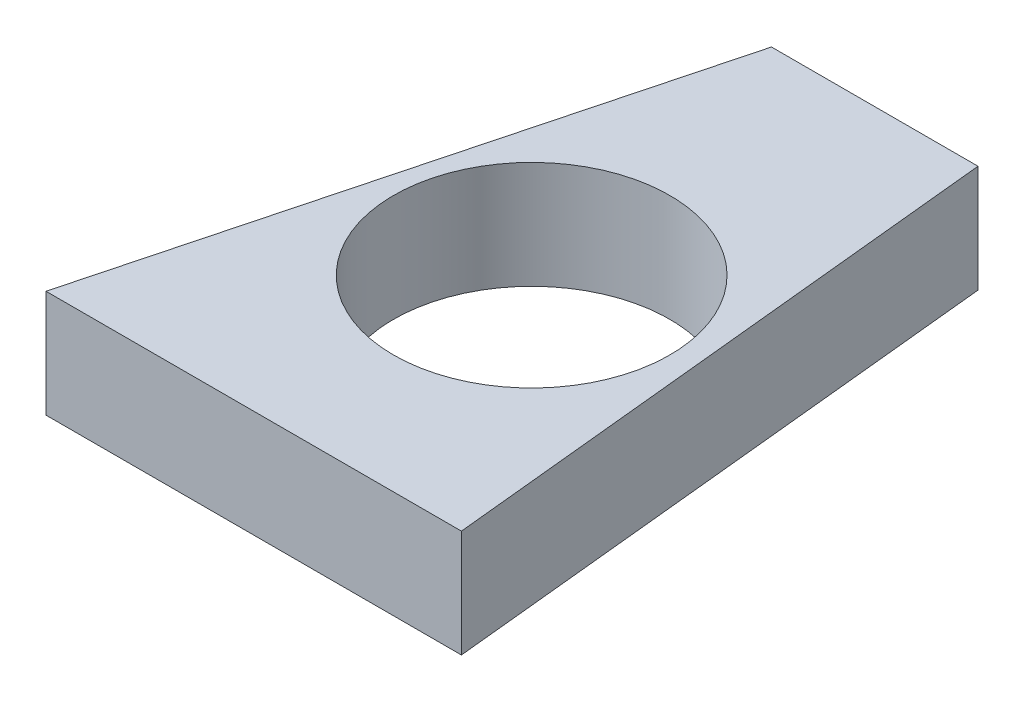
ISO-10303-21;
HEADER;
FILE_DESCRIPTION(('STEP AP214'),'2;1');
FILE_NAME('part.step','',(''),(''),'','','');
FILE_SCHEMA(('AUTOMOTIVE_DESIGN { 1 0 10303 214 1 1 1 1 }'));
ENDSEC;
DATA;
#1=APPLICATION_CONTEXT('core data for automotive mechanical design processes');
#2=APPLICATION_PROTOCOL_DEFINITION('international standard','automotive_design',2000,#1);
#3=PRODUCT_CONTEXT('',#1,'mechanical');
#4=PRODUCT('Part','Part','',(#3));
#5=PRODUCT_RELATED_PRODUCT_CATEGORY('part','',(#4));
#6=PRODUCT_DEFINITION_FORMATION('','',#4);
#7=PRODUCT_DEFINITION_CONTEXT('part definition',#1,'design');
#8=PRODUCT_DEFINITION('design','',#6,#7);
#9=PRODUCT_DEFINITION_SHAPE('','',#8);
#10=(LENGTH_UNIT() NAMED_UNIT(*) SI_UNIT(.MILLI.,.METRE.));
#11=(NAMED_UNIT(*) PLANE_ANGLE_UNIT() SI_UNIT($,.RADIAN.));
#12=(NAMED_UNIT(*) SI_UNIT($,.STERADIAN.) SOLID_ANGLE_UNIT());
#13=UNCERTAINTY_MEASURE_WITH_UNIT(LENGTH_MEASURE(1.E-05),#10,'distance_accuracy_value','');
#14=(GEOMETRIC_REPRESENTATION_CONTEXT(3) GLOBAL_UNCERTAINTY_ASSIGNED_CONTEXT((#13)) GLOBAL_UNIT_ASSIGNED_CONTEXT((#10,
#11,#12)) REPRESENTATION_CONTEXT('',''));
#15=CARTESIAN_POINT('',(0.,0.,0.));
#16=DIRECTION('',(0.,0.,1.));
#17=DIRECTION('',(1.,0.,0.));
#18=AXIS2_PLACEMENT_3D('',#15,#16,#17);
#19=CARTESIAN_POINT('',(0.,36.5,-108.014745967656));
#20=DIRECTION('',(0.,0.,1.));
#21=DIRECTION('',(1.,0.,0.));
#22=AXIS2_PLACEMENT_3D('',#19,#20,#21);
#23=PLANE('',#22);
#24=DIRECTION('',(-1.,0.,0.));
#25=VECTOR('',#24,1.);
#26=CARTESIAN_POINT('',(0.,0.,-108.014745967656));
#27=LINE('',#26,#25);
#28=CARTESIAN_POINT('',(43.8039566085295,0.,-108.014745967656));
#29=VERTEX_POINT('',#28);
#30=CARTESIAN_POINT('',(-26.4419625069111,0.,-108.014745967656));
#31=VERTEX_POINT('',#30);
#32=EDGE_CURVE('E116',#29,#31,#27,.T.);
#33=ORIENTED_EDGE('',*,*,#32,.T.);
#34=DIRECTION('',(0.,-1.,0.));
#35=VECTOR('',#34,1.);
#36=CARTESIAN_POINT('',(-26.4419625069111,36.5,-108.014745967656));
#37=LINE('',#36,#35);
#38=CARTESIAN_POINT('',(-26.4419625069111,36.5,-108.014745967656));
#39=VERTEX_POINT('',#38);
#40=EDGE_CURVE('E11',#39,#31,#37,.T.);
#41=ORIENTED_EDGE('',*,*,#40,.F.);
#42=DIRECTION('',(-1.,0.,0.));
#43=VECTOR('',#42,1.);
#44=CARTESIAN_POINT('',(0.,36.5,-108.014745967656));
#45=LINE('',#44,#43);
#46=CARTESIAN_POINT('',(43.8039566085295,36.5,-108.014745967656));
#47=VERTEX_POINT('',#46);
#48=EDGE_CURVE('E96',#47,#39,#45,.T.);
#49=ORIENTED_EDGE('',*,*,#48,.F.);
#50=DIRECTION('',(0.,-1.,0.));
#51=VECTOR('',#50,1.);
#52=CARTESIAN_POINT('',(43.8039566085295,36.5,-108.014745967656));
#53=LINE('',#52,#51);
#54=EDGE_CURVE('E108',#47,#29,#53,.T.);
#55=ORIENTED_EDGE('',*,*,#54,.T.);
#56=EDGE_LOOP('',(#33,#41,#49,#55));
#57=FACE_BOUND('',#56,.T.);
#58=ADVANCED_FACE('F43',(#57),#23,.F.);
#59=CARTESIAN_POINT('',(-51.3222942082459,36.5,-13.5119333265078));
#60=DIRECTION('',(0.967046398699349,0.,0.254600201811821));
#61=DIRECTION('',(0.254600201811821,0.,-0.967046398699349));
#62=AXIS2_PLACEMENT_3D('',#59,#60,#61);
#63=PLANE('',#62);
#64=DIRECTION('',(-0.254600201811821,0.,0.967046398699349));
#65=VECTOR('',#64,1.);
#66=CARTESIAN_POINT('',(-51.3222942082459,0.,-13.5119333265078));
#67=LINE('',#66,#65);
#68=CARTESIAN_POINT('',(-77.8701337554765,0.,87.3245642280891));
#69=VERTEX_POINT('',#68);
#70=EDGE_CURVE('E101',#31,#69,#67,.T.);
#71=ORIENTED_EDGE('',*,*,#70,.T.);
#72=DIRECTION('',(0.,-1.,0.));
#73=VECTOR('',#72,1.);
#74=CARTESIAN_POINT('',(-77.8701337554765,36.5,87.3245642280891));
#75=LINE('',#74,#73);
#76=CARTESIAN_POINT('',(-77.8701337554765,36.5,87.3245642280891));
#77=VERTEX_POINT('',#76);
#78=EDGE_CURVE('E53',#77,#69,#75,.T.);
#79=ORIENTED_EDGE('',*,*,#78,.F.);
#80=DIRECTION('',(-0.254600201811821,0.,0.967046398699349));
#81=VECTOR('',#80,1.);
#82=CARTESIAN_POINT('',(-51.3222942082459,36.5,-13.5119333265078));
#83=LINE('',#82,#81);
#84=EDGE_CURVE('E91',#39,#77,#83,.T.);
#85=ORIENTED_EDGE('',*,*,#84,.F.);
#86=ORIENTED_EDGE('',*,*,#40,.T.);
#87=EDGE_LOOP('',(#71,#79,#85,#86));
#88=FACE_BOUND('',#87,.T.);
#89=ADVANCED_FACE('F100',(#88),#63,.F.);
#90=CARTESIAN_POINT('',(0.,36.5,87.3245642280891));
#91=DIRECTION('',(0.,0.,-1.));
#92=DIRECTION('',(-1.,0.,0.));
#93=AXIS2_PLACEMENT_3D('',#90,#91,#92);
#94=PLANE('',#93);
#95=DIRECTION('',(1.,0.,0.));
#96=VECTOR('',#95,1.);
#97=CARTESIAN_POINT('',(0.,0.,87.3245642280891));
#98=LINE('',#97,#96);
#99=CARTESIAN_POINT('',(63.4336388966082,0.,87.3245642280891));
#100=VERTEX_POINT('',#99);
#101=EDGE_CURVE('E78',#69,#100,#98,.T.);
#102=ORIENTED_EDGE('',*,*,#101,.T.);
#103=DIRECTION('',(0.,-1.,0.));
#104=VECTOR('',#103,1.);
#105=CARTESIAN_POINT('',(63.4336388966082,36.5,87.3245642280891));
#106=LINE('',#105,#104);
#107=CARTESIAN_POINT('',(63.4336388966082,36.5,87.3245642280891));
#108=VERTEX_POINT('',#107);
#109=EDGE_CURVE('E103',#108,#100,#106,.T.);
#110=ORIENTED_EDGE('',*,*,#109,.F.);
#111=DIRECTION('',(1.,0.,0.));
#112=VECTOR('',#111,1.);
#113=CARTESIAN_POINT('',(0.,36.5,87.3245642280891));
#114=LINE('',#113,#112);
#115=EDGE_CURVE('E94',#77,#108,#114,.T.);
#116=ORIENTED_EDGE('',*,*,#115,.F.);
#117=ORIENTED_EDGE('',*,*,#78,.T.);
#118=EDGE_LOOP('',(#102,#110,#116,#117));
#119=FACE_BOUND('',#118,.T.);
#120=ADVANCED_FACE('F104',(#119),#94,.F.);
#121=CARTESIAN_POINT('',(0.,36.5,0.));
#122=DIRECTION('',(0.,-1.,0.));
#123=DIRECTION('',(0.,0.,-1.));
#124=AXIS2_PLACEMENT_3D('',#121,#122,#123);
#125=CYLINDRICAL_SURFACE('',#124,47.);
#126=CARTESIAN_POINT('',(0.,36.5,0.));
#127=DIRECTION('',(0.,1.,0.));
#128=DIRECTION('',(0.,0.,1.));
#129=AXIS2_PLACEMENT_3D('',#126,#127,#128);
#130=CIRCLE('',#129,47.);
#131=CARTESIAN_POINT('',(0.,36.5,47.));
#132=VERTEX_POINT('',#131);
#133=EDGE_CURVE('E126',#132,#132,#130,.T.);
#134=ORIENTED_EDGE('',*,*,#133,.T.);
#135=EDGE_LOOP('',(#134));
#136=FACE_BOUND('',#135,.T.);
#137=CARTESIAN_POINT('',(0.,0.,0.));
#138=DIRECTION('',(0.,1.,0.));
#139=DIRECTION('',(0.,0.,1.));
#140=AXIS2_PLACEMENT_3D('',#137,#138,#139);
#141=CIRCLE('',#140,47.);
#142=CARTESIAN_POINT('',(0.,0.,47.));
#143=VERTEX_POINT('',#142);
#144=EDGE_CURVE('E112',#143,#143,#141,.T.);
#145=ORIENTED_EDGE('',*,*,#144,.F.);
#146=EDGE_LOOP('',(#145));
#147=FACE_BOUND('',#146,.T.);
#148=ADVANCED_FACE('F45',(#136,#147),#125,.F.);
#149=CARTESIAN_POINT('',(54.1119404718706,36.5,-5.43771859535001));
#150=DIRECTION('',(-0.994988783647629,0.,0.0999866011794193));
#151=DIRECTION('',(0.0999866011794194,0.,0.994988783647629));
#152=AXIS2_PLACEMENT_3D('',#149,#150,#151);
#153=PLANE('',#152);
#154=DIRECTION('',(-0.0999866011794194,0.,-0.994988783647629));
#155=VECTOR('',#154,1.);
#156=CARTESIAN_POINT('',(54.1119404718706,0.,-5.43771859535001));
#157=LINE('',#156,#155);
#158=EDGE_CURVE('E84',#100,#29,#157,.T.);
#159=ORIENTED_EDGE('',*,*,#158,.T.);
#160=ORIENTED_EDGE('',*,*,#54,.F.);
#161=DIRECTION('',(-0.0999866011794194,0.,-0.994988783647629));
#162=VECTOR('',#161,1.);
#163=CARTESIAN_POINT('',(54.1119404718706,36.5,-5.43771859535001));
#164=LINE('',#163,#162);
#165=EDGE_CURVE('E61',#108,#47,#164,.T.);
#166=ORIENTED_EDGE('',*,*,#165,.F.);
#167=ORIENTED_EDGE('',*,*,#109,.T.);
#168=EDGE_LOOP('',(#159,#160,#166,#167));
#169=FACE_BOUND('',#168,.T.);
#170=ADVANCED_FACE('F130',(#169),#153,.F.);
#171=CARTESIAN_POINT('',(0.,36.5,0.));
#172=DIRECTION('',(0.,1.,0.));
#173=DIRECTION('',(0.,0.,1.));
#174=AXIS2_PLACEMENT_3D('',#171,#172,#173);
#175=PLANE('',#174);
#176=ORIENTED_EDGE('',*,*,#133,.F.);
#177=EDGE_LOOP('',(#176));
#178=FACE_BOUND('',#177,.T.);
#179=ORIENTED_EDGE('',*,*,#48,.T.);
#180=ORIENTED_EDGE('',*,*,#84,.T.);
#181=ORIENTED_EDGE('',*,*,#115,.T.);
#182=ORIENTED_EDGE('',*,*,#165,.T.);
#183=EDGE_LOOP('',(#179,#180,#181,#182));
#184=FACE_BOUND('',#183,.T.);
#185=ADVANCED_FACE('F92',(#178,#184),#175,.T.);
#186=CARTESIAN_POINT('',(0.,0.,0.));
#187=DIRECTION('',(0.,1.,0.));
#188=DIRECTION('',(0.,0.,1.));
#189=AXIS2_PLACEMENT_3D('',#186,#187,#188);
#190=PLANE('',#189);
#191=ORIENTED_EDGE('',*,*,#144,.T.);
#192=EDGE_LOOP('',(#191));
#193=FACE_BOUND('',#192,.T.);
#194=ORIENTED_EDGE('',*,*,#32,.F.);
#195=ORIENTED_EDGE('',*,*,#158,.F.);
#196=ORIENTED_EDGE('',*,*,#101,.F.);
#197=ORIENTED_EDGE('',*,*,#70,.F.);
#198=EDGE_LOOP('',(#194,#195,#196,#197));
#199=FACE_BOUND('',#198,.T.);
#200=ADVANCED_FACE('F133',(#193,#199),#190,.F.);
#201=CLOSED_SHELL('',(#58,#89,#120,#148,#170,#185,#200));
#202=MANIFOLD_SOLID_BREP('B2',#201);
#203=ADVANCED_BREP_SHAPE_REPRESENTATION('',(#18,#202),#14);
#204=SHAPE_DEFINITION_REPRESENTATION(#9,#203);
ENDSEC;
END-ISO-10303-21;
